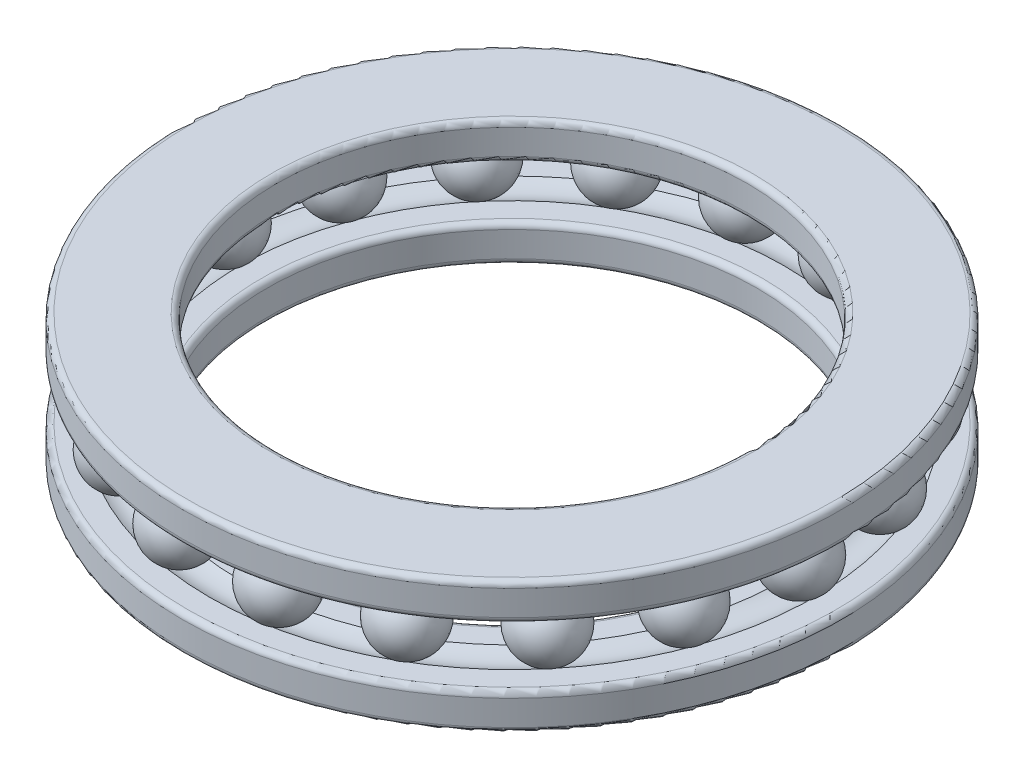
ISO-10303-21;
HEADER;
FILE_DESCRIPTION(('STEP AP214'),'2;1');
FILE_NAME('part.step','',(''),(''),'','','');
FILE_SCHEMA(('AUTOMOTIVE_DESIGN { 1 0 10303 214 1 1 1 1 }'));
ENDSEC;
DATA;
#1=APPLICATION_CONTEXT('core data for automotive mechanical design processes');
#2=APPLICATION_PROTOCOL_DEFINITION('international standard','automotive_design',2000,#1);
#3=PRODUCT_CONTEXT('',#1,'mechanical');
#4=PRODUCT('Part','Part','',(#3));
#5=PRODUCT_RELATED_PRODUCT_CATEGORY('part','',(#4));
#6=PRODUCT_DEFINITION_FORMATION('','',#4);
#7=PRODUCT_DEFINITION_CONTEXT('part definition',#1,'design');
#8=PRODUCT_DEFINITION('design','',#6,#7);
#9=PRODUCT_DEFINITION_SHAPE('','',#8);
#10=(LENGTH_UNIT() NAMED_UNIT(*) SI_UNIT(.MILLI.,.METRE.));
#11=(NAMED_UNIT(*) PLANE_ANGLE_UNIT() SI_UNIT($,.RADIAN.));
#12=(NAMED_UNIT(*) SI_UNIT($,.STERADIAN.) SOLID_ANGLE_UNIT());
#13=UNCERTAINTY_MEASURE_WITH_UNIT(LENGTH_MEASURE(1.E-05),#10,'distance_accuracy_value','');
#14=(GEOMETRIC_REPRESENTATION_CONTEXT(3) GLOBAL_UNCERTAINTY_ASSIGNED_CONTEXT((#13)) GLOBAL_UNIT_ASSIGNED_CONTEXT((#10,
#11,#12)) REPRESENTATION_CONTEXT('',''));
#15=CARTESIAN_POINT('',(0.,0.,0.));
#16=DIRECTION('',(0.,0.,1.));
#17=DIRECTION('',(1.,0.,0.));
#18=AXIS2_PLACEMENT_3D('',#15,#16,#17);
#19=CARTESIAN_POINT('',(-30.5,7.,0.));
#20=DIRECTION('',(0.,-1.,0.));
#21=DIRECTION('',(1.,0.,0.));
#22=AXIS2_PLACEMENT_3D('',#19,#20,#21);
#23=SPHERICAL_SURFACE('',#22,3.5);
#24=CARTESIAN_POINT('',(-30.5,10.5,0.));
#25=VERTEX_POINT('',#24);
#26=VERTEX_LOOP('',#25);
#27=FACE_BOUND('',#26,.T.);
#28=CARTESIAN_POINT('',(-30.5,3.5,0.));
#29=VERTEX_POINT('',#28);
#30=VERTEX_LOOP('',#29);
#31=FACE_BOUND('',#30,.T.);
#32=ADVANCED_FACE('P0_F15',(#27,#31),#23,.T.);
#33=CLOSED_SHELL('',(#32));
#34=MANIFOLD_SOLID_BREP('P0_B1',#33);
#35=CARTESIAN_POINT('',(30.5,7.,0.));
#36=DIRECTION('',(0.,-1.,0.));
#37=DIRECTION('',(1.,0.,0.));
#38=AXIS2_PLACEMENT_3D('',#35,#36,#37);
#39=SPHERICAL_SURFACE('',#38,3.5);
#40=CARTESIAN_POINT('',(30.5,10.5,0.));
#41=VERTEX_POINT('',#40);
#42=VERTEX_LOOP('',#41);
#43=FACE_BOUND('',#42,.T.);
#44=CARTESIAN_POINT('',(30.5,3.5,0.));
#45=VERTEX_POINT('',#44);
#46=VERTEX_LOOP('',#45);
#47=FACE_BOUND('',#46,.T.);
#48=ADVANCED_FACE('P1_F15',(#43,#47),#39,.T.);
#49=CLOSED_SHELL('',(#48));
#50=MANIFOLD_SOLID_BREP('P1_B1',#49);
#51=CARTESIAN_POINT('',(28.66062493397,7.,-10.431614371433));
#52=DIRECTION('',(0.,-1.,0.));
#53=DIRECTION('',(1.,0.,0.));
#54=AXIS2_PLACEMENT_3D('',#51,#52,#53);
#55=SPHERICAL_SURFACE('',#54,3.5);
#56=CARTESIAN_POINT('',(28.66062493397,10.5,-10.431614371433));
#57=VERTEX_POINT('',#56);
#58=VERTEX_LOOP('',#57);
#59=FACE_BOUND('',#58,.T.);
#60=CARTESIAN_POINT('',(28.66062493397,3.5,-10.431614371433));
#61=VERTEX_POINT('',#60);
#62=VERTEX_LOOP('',#61);
#63=FACE_BOUND('',#62,.T.);
#64=ADVANCED_FACE('P2_F15',(#59,#63),#55,.T.);
#65=CLOSED_SHELL('',(#64));
#66=MANIFOLD_SOLID_BREP('P2_B1',#65);
#67=CARTESIAN_POINT('',(23.364355515129,7.,-19.605022095439));
#68=DIRECTION('',(0.,-1.,0.));
#69=DIRECTION('',(1.,0.,0.));
#70=AXIS2_PLACEMENT_3D('',#67,#68,#69);
#71=SPHERICAL_SURFACE('',#70,3.5);
#72=CARTESIAN_POINT('',(23.364355515129,10.5,-19.605022095439));
#73=VERTEX_POINT('',#72);
#74=VERTEX_LOOP('',#73);
#75=FACE_BOUND('',#74,.T.);
#76=CARTESIAN_POINT('',(23.364355515129,3.5,-19.605022095439));
#77=VERTEX_POINT('',#76);
#78=VERTEX_LOOP('',#77);
#79=FACE_BOUND('',#78,.T.);
#80=ADVANCED_FACE('P3_F15',(#75,#79),#71,.T.);
#81=CLOSED_SHELL('',(#80));
#82=MANIFOLD_SOLID_BREP('P3_B1',#81);
#83=CARTESIAN_POINT('',(15.25,7.,-26.413774815425));
#84=DIRECTION('',(0.,-1.,0.));
#85=DIRECTION('',(1.,0.,0.));
#86=AXIS2_PLACEMENT_3D('',#83,#84,#85);
#87=SPHERICAL_SURFACE('',#86,3.5);
#88=CARTESIAN_POINT('',(15.25,10.5,-26.413774815425));
#89=VERTEX_POINT('',#88);
#90=VERTEX_LOOP('',#89);
#91=FACE_BOUND('',#90,.T.);
#92=CARTESIAN_POINT('',(15.25,3.5,-26.413774815425));
#93=VERTEX_POINT('',#92);
#94=VERTEX_LOOP('',#93);
#95=FACE_BOUND('',#94,.T.);
#96=ADVANCED_FACE('P4_F15',(#91,#95),#87,.T.);
#97=CLOSED_SHELL('',(#96));
#98=MANIFOLD_SOLID_BREP('P4_B1',#97);
#99=CARTESIAN_POINT('',(5.2962694188414,7.,-30.036636466872));
#100=DIRECTION('',(0.,-1.,0.));
#101=DIRECTION('',(1.,0.,0.));
#102=AXIS2_PLACEMENT_3D('',#99,#100,#101);
#103=SPHERICAL_SURFACE('',#102,3.5);
#104=CARTESIAN_POINT('',(5.2962694188414,10.5,-30.036636466872));
#105=VERTEX_POINT('',#104);
#106=VERTEX_LOOP('',#105);
#107=FACE_BOUND('',#106,.T.);
#108=CARTESIAN_POINT('',(5.2962694188414,3.5,-30.036636466872));
#109=VERTEX_POINT('',#108);
#110=VERTEX_LOOP('',#109);
#111=FACE_BOUND('',#110,.T.);
#112=ADVANCED_FACE('P5_F15',(#107,#111),#103,.T.);
#113=CLOSED_SHELL('',(#112));
#114=MANIFOLD_SOLID_BREP('P5_B1',#113);
#115=CARTESIAN_POINT('',(-5.2962694188414,7.,-30.036636466872));
#116=DIRECTION('',(0.,-1.,0.));
#117=DIRECTION('',(1.,0.,0.));
#118=AXIS2_PLACEMENT_3D('',#115,#116,#117);
#119=SPHERICAL_SURFACE('',#118,3.5);
#120=CARTESIAN_POINT('',(-5.2962694188414,10.5,-30.036636466872));
#121=VERTEX_POINT('',#120);
#122=VERTEX_LOOP('',#121);
#123=FACE_BOUND('',#122,.T.);
#124=CARTESIAN_POINT('',(-5.2962694188414,3.5,-30.036636466872));
#125=VERTEX_POINT('',#124);
#126=VERTEX_LOOP('',#125);
#127=FACE_BOUND('',#126,.T.);
#128=ADVANCED_FACE('P6_F15',(#123,#127),#119,.T.);
#129=CLOSED_SHELL('',(#128));
#130=MANIFOLD_SOLID_BREP('P6_B1',#129);
#131=CARTESIAN_POINT('',(-15.25,7.,-26.413774815425));
#132=DIRECTION('',(0.,-1.,0.));
#133=DIRECTION('',(1.,0.,0.));
#134=AXIS2_PLACEMENT_3D('',#131,#132,#133);
#135=SPHERICAL_SURFACE('',#134,3.5);
#136=CARTESIAN_POINT('',(-15.25,10.5,-26.413774815425));
#137=VERTEX_POINT('',#136);
#138=VERTEX_LOOP('',#137);
#139=FACE_BOUND('',#138,.T.);
#140=CARTESIAN_POINT('',(-15.25,3.5,-26.413774815425));
#141=VERTEX_POINT('',#140);
#142=VERTEX_LOOP('',#141);
#143=FACE_BOUND('',#142,.T.);
#144=ADVANCED_FACE('P7_F15',(#139,#143),#135,.T.);
#145=CLOSED_SHELL('',(#144));
#146=MANIFOLD_SOLID_BREP('P7_B1',#145);
#147=CARTESIAN_POINT('',(-23.364355515129,7.,-19.605022095439));
#148=DIRECTION('',(0.,-1.,0.));
#149=DIRECTION('',(1.,0.,0.));
#150=AXIS2_PLACEMENT_3D('',#147,#148,#149);
#151=SPHERICAL_SURFACE('',#150,3.5);
#152=CARTESIAN_POINT('',(-23.364355515129,10.5,-19.605022095439));
#153=VERTEX_POINT('',#152);
#154=VERTEX_LOOP('',#153);
#155=FACE_BOUND('',#154,.T.);
#156=CARTESIAN_POINT('',(-23.364355515129,3.5,-19.605022095439));
#157=VERTEX_POINT('',#156);
#158=VERTEX_LOOP('',#157);
#159=FACE_BOUND('',#158,.T.);
#160=ADVANCED_FACE('P8_F15',(#155,#159),#151,.T.);
#161=CLOSED_SHELL('',(#160));
#162=MANIFOLD_SOLID_BREP('P8_B1',#161);
#163=CARTESIAN_POINT('',(-28.66062493397,7.,-10.431614371433));
#164=DIRECTION('',(0.,-1.,0.));
#165=DIRECTION('',(1.,0.,0.));
#166=AXIS2_PLACEMENT_3D('',#163,#164,#165);
#167=SPHERICAL_SURFACE('',#166,3.5);
#168=CARTESIAN_POINT('',(-28.66062493397,10.5,-10.431614371433));
#169=VERTEX_POINT('',#168);
#170=VERTEX_LOOP('',#169);
#171=FACE_BOUND('',#170,.T.);
#172=CARTESIAN_POINT('',(-28.66062493397,3.5,-10.431614371433));
#173=VERTEX_POINT('',#172);
#174=VERTEX_LOOP('',#173);
#175=FACE_BOUND('',#174,.T.);
#176=ADVANCED_FACE('P9_F15',(#171,#175),#167,.T.);
#177=CLOSED_SHELL('',(#176));
#178=MANIFOLD_SOLID_BREP('P9_B1',#177);
#179=CARTESIAN_POINT('',(-28.66062493397,7.,10.431614371433));
#180=DIRECTION('',(0.,-1.,0.));
#181=DIRECTION('',(1.,0.,0.));
#182=AXIS2_PLACEMENT_3D('',#179,#180,#181);
#183=SPHERICAL_SURFACE('',#182,3.5);
#184=CARTESIAN_POINT('',(-28.66062493397,10.5,10.431614371433));
#185=VERTEX_POINT('',#184);
#186=VERTEX_LOOP('',#185);
#187=FACE_BOUND('',#186,.T.);
#188=CARTESIAN_POINT('',(-28.66062493397,3.5,10.431614371433));
#189=VERTEX_POINT('',#188);
#190=VERTEX_LOOP('',#189);
#191=FACE_BOUND('',#190,.T.);
#192=ADVANCED_FACE('P10_F15',(#187,#191),#183,.T.);
#193=CLOSED_SHELL('',(#192));
#194=MANIFOLD_SOLID_BREP('P10_B1',#193);
#195=CARTESIAN_POINT('',(-23.364355515129,7.,19.605022095439));
#196=DIRECTION('',(0.,-1.,0.));
#197=DIRECTION('',(1.,0.,0.));
#198=AXIS2_PLACEMENT_3D('',#195,#196,#197);
#199=SPHERICAL_SURFACE('',#198,3.5);
#200=CARTESIAN_POINT('',(-23.364355515129,10.5,19.605022095439));
#201=VERTEX_POINT('',#200);
#202=VERTEX_LOOP('',#201);
#203=FACE_BOUND('',#202,.T.);
#204=CARTESIAN_POINT('',(-23.364355515129,3.5,19.605022095439));
#205=VERTEX_POINT('',#204);
#206=VERTEX_LOOP('',#205);
#207=FACE_BOUND('',#206,.T.);
#208=ADVANCED_FACE('P11_F15',(#203,#207),#199,.T.);
#209=CLOSED_SHELL('',(#208));
#210=MANIFOLD_SOLID_BREP('P11_B1',#209);
#211=CARTESIAN_POINT('',(-15.25,7.,26.413774815425));
#212=DIRECTION('',(0.,-1.,0.));
#213=DIRECTION('',(1.,0.,0.));
#214=AXIS2_PLACEMENT_3D('',#211,#212,#213);
#215=SPHERICAL_SURFACE('',#214,3.5);
#216=CARTESIAN_POINT('',(-15.25,10.5,26.413774815425));
#217=VERTEX_POINT('',#216);
#218=VERTEX_LOOP('',#217);
#219=FACE_BOUND('',#218,.T.);
#220=CARTESIAN_POINT('',(-15.25,3.5,26.413774815425));
#221=VERTEX_POINT('',#220);
#222=VERTEX_LOOP('',#221);
#223=FACE_BOUND('',#222,.T.);
#224=ADVANCED_FACE('P12_F15',(#219,#223),#215,.T.);
#225=CLOSED_SHELL('',(#224));
#226=MANIFOLD_SOLID_BREP('P12_B1',#225);
#227=CARTESIAN_POINT('',(-5.2962694188414,7.,30.036636466872));
#228=DIRECTION('',(0.,-1.,0.));
#229=DIRECTION('',(1.,0.,0.));
#230=AXIS2_PLACEMENT_3D('',#227,#228,#229);
#231=SPHERICAL_SURFACE('',#230,3.5);
#232=CARTESIAN_POINT('',(-5.2962694188414,10.5,30.036636466872));
#233=VERTEX_POINT('',#232);
#234=VERTEX_LOOP('',#233);
#235=FACE_BOUND('',#234,.T.);
#236=CARTESIAN_POINT('',(-5.2962694188414,3.5,30.036636466872));
#237=VERTEX_POINT('',#236);
#238=VERTEX_LOOP('',#237);
#239=FACE_BOUND('',#238,.T.);
#240=ADVANCED_FACE('P13_F15',(#235,#239),#231,.T.);
#241=CLOSED_SHELL('',(#240));
#242=MANIFOLD_SOLID_BREP('P13_B1',#241);
#243=CARTESIAN_POINT('',(5.2962694188414,7.,30.036636466872));
#244=DIRECTION('',(0.,-1.,0.));
#245=DIRECTION('',(1.,0.,0.));
#246=AXIS2_PLACEMENT_3D('',#243,#244,#245);
#247=SPHERICAL_SURFACE('',#246,3.5);
#248=CARTESIAN_POINT('',(5.2962694188414,10.5,30.036636466872));
#249=VERTEX_POINT('',#248);
#250=VERTEX_LOOP('',#249);
#251=FACE_BOUND('',#250,.T.);
#252=CARTESIAN_POINT('',(5.2962694188414,3.5,30.036636466872));
#253=VERTEX_POINT('',#252);
#254=VERTEX_LOOP('',#253);
#255=FACE_BOUND('',#254,.T.);
#256=ADVANCED_FACE('P14_F15',(#251,#255),#247,.T.);
#257=CLOSED_SHELL('',(#256));
#258=MANIFOLD_SOLID_BREP('P14_B1',#257);
#259=CARTESIAN_POINT('',(15.25,7.,26.413774815425));
#260=DIRECTION('',(0.,-1.,0.));
#261=DIRECTION('',(1.,0.,0.));
#262=AXIS2_PLACEMENT_3D('',#259,#260,#261);
#263=SPHERICAL_SURFACE('',#262,3.5);
#264=CARTESIAN_POINT('',(15.25,10.5,26.413774815425));
#265=VERTEX_POINT('',#264);
#266=VERTEX_LOOP('',#265);
#267=FACE_BOUND('',#266,.T.);
#268=CARTESIAN_POINT('',(15.25,3.5,26.413774815425));
#269=VERTEX_POINT('',#268);
#270=VERTEX_LOOP('',#269);
#271=FACE_BOUND('',#270,.T.);
#272=ADVANCED_FACE('P15_F15',(#267,#271),#263,.T.);
#273=CLOSED_SHELL('',(#272));
#274=MANIFOLD_SOLID_BREP('P15_B1',#273);
#275=CARTESIAN_POINT('',(23.364355515129,7.,19.605022095439));
#276=DIRECTION('',(0.,-1.,0.));
#277=DIRECTION('',(1.,0.,0.));
#278=AXIS2_PLACEMENT_3D('',#275,#276,#277);
#279=SPHERICAL_SURFACE('',#278,3.5);
#280=CARTESIAN_POINT('',(23.364355515129,10.5,19.605022095439));
#281=VERTEX_POINT('',#280);
#282=VERTEX_LOOP('',#281);
#283=FACE_BOUND('',#282,.T.);
#284=CARTESIAN_POINT('',(23.364355515129,3.5,19.605022095439));
#285=VERTEX_POINT('',#284);
#286=VERTEX_LOOP('',#285);
#287=FACE_BOUND('',#286,.T.);
#288=ADVANCED_FACE('P16_F15',(#283,#287),#279,.T.);
#289=CLOSED_SHELL('',(#288));
#290=MANIFOLD_SOLID_BREP('P16_B1',#289);
#291=CARTESIAN_POINT('',(28.66062493397,7.,10.431614371433));
#292=DIRECTION('',(0.,-1.,0.));
#293=DIRECTION('',(1.,0.,0.));
#294=AXIS2_PLACEMENT_3D('',#291,#292,#293);
#295=SPHERICAL_SURFACE('',#294,3.5);
#296=CARTESIAN_POINT('',(28.66062493397,10.5,10.431614371433));
#297=VERTEX_POINT('',#296);
#298=VERTEX_LOOP('',#297);
#299=FACE_BOUND('',#298,.T.);
#300=CARTESIAN_POINT('',(28.66062493397,3.5,10.431614371433));
#301=VERTEX_POINT('',#300);
#302=VERTEX_LOOP('',#301);
#303=FACE_BOUND('',#302,.T.);
#304=ADVANCED_FACE('P17_F15',(#299,#303),#295,.T.);
#305=CLOSED_SHELL('',(#304));
#306=MANIFOLD_SOLID_BREP('P17_B1',#305);
#307=CARTESIAN_POINT('',(-34.4,0.,0.));
#308=DIRECTION('',(0.,-1.,0.));
#309=DIRECTION('',(0.,0.,-1.));
#310=AXIS2_PLACEMENT_3D('',#307,#308,#309);
#311=PLANE('',#310);
#312=CARTESIAN_POINT('',(0.,0.,0.));
#313=DIRECTION('',(0.,1.,0.));
#314=DIRECTION('',(0.,0.,1.));
#315=AXIS2_PLACEMENT_3D('',#312,#313,#314);
#316=CIRCLE('',#315,26.6);
#317=CARTESIAN_POINT('',(0.,0.,26.6));
#318=VERTEX_POINT('',#317);
#319=EDGE_CURVE('P18_E58',#318,#318,#316,.T.);
#320=ORIENTED_EDGE('',*,*,#319,.T.);
#321=EDGE_LOOP('',(#320));
#322=FACE_BOUND('',#321,.T.);
#323=CARTESIAN_POINT('',(0.,0.,0.));
#324=DIRECTION('',(0.,1.,0.));
#325=DIRECTION('',(0.,0.,1.));
#326=AXIS2_PLACEMENT_3D('',#323,#324,#325);
#327=CIRCLE('',#326,34.4);
#328=CARTESIAN_POINT('',(0.,0.,34.4));
#329=VERTEX_POINT('',#328);
#330=EDGE_CURVE('P18_E57',#329,#329,#327,.T.);
#331=ORIENTED_EDGE('',*,*,#330,.F.);
#332=EDGE_LOOP('',(#331));
#333=FACE_BOUND('',#332,.T.);
#334=ADVANCED_FACE('P18_F15',(#322,#333),#311,.T.);
#335=CARTESIAN_POINT('',(0.,0.599999999999872,0.));
#336=DIRECTION('',(0.,1.,0.));
#337=DIRECTION('',(0.,0.,1.));
#338=AXIS2_PLACEMENT_3D('',#335,#336,#337);
#339=TOROIDAL_SURFACE('',#338,26.6,0.599999999999872);
#340=CARTESIAN_POINT('',(0.,0.6,0.));
#341=DIRECTION('',(0.,1.,0.));
#342=DIRECTION('',(0.,0.,1.));
#343=AXIS2_PLACEMENT_3D('',#340,#341,#342);
#344=CIRCLE('',#343,26.);
#345=CARTESIAN_POINT('',(0.,0.6,26.));
#346=VERTEX_POINT('',#345);
#347=EDGE_CURVE('P18_E55',#346,#346,#344,.T.);
#348=ORIENTED_EDGE('',*,*,#347,.T.);
#349=EDGE_LOOP('',(#348));
#350=FACE_BOUND('',#349,.T.);
#351=ORIENTED_EDGE('',*,*,#319,.F.);
#352=EDGE_LOOP('',(#351));
#353=FACE_BOUND('',#352,.T.);
#354=ADVANCED_FACE('P18_F69',(#350,#353),#339,.T.);
#355=CARTESIAN_POINT('',(0.,3.8888888888889,0.));
#356=DIRECTION('',(0.,1.,0.));
#357=DIRECTION('',(0.,0.,1.));
#358=AXIS2_PLACEMENT_3D('',#355,#356,#357);
#359=CYLINDRICAL_SURFACE('',#358,26.);
#360=CARTESIAN_POINT('',(0.,3.2888888888889,0.));
#361=DIRECTION('',(0.,1.,0.));
#362=DIRECTION('',(0.,0.,1.));
#363=AXIS2_PLACEMENT_3D('',#360,#361,#362);
#364=CIRCLE('',#363,26.);
#365=CARTESIAN_POINT('',(0.,3.2888888888889,26.));
#366=VERTEX_POINT('',#365);
#367=EDGE_CURVE('P18_E48',#366,#366,#364,.T.);
#368=ORIENTED_EDGE('',*,*,#367,.T.);
#369=EDGE_LOOP('',(#368));
#370=FACE_BOUND('',#369,.T.);
#371=ORIENTED_EDGE('',*,*,#347,.F.);
#372=EDGE_LOOP('',(#371));
#373=FACE_BOUND('',#372,.T.);
#374=ADVANCED_FACE('P18_F70',(#370,#373),#359,.F.);
#375=CARTESIAN_POINT('',(0.,3.28888888888898,0.));
#376=DIRECTION('',(0.,1.,0.));
#377=DIRECTION('',(0.,0.,1.));
#378=AXIS2_PLACEMENT_3D('',#375,#376,#377);
#379=TOROIDAL_SURFACE('',#378,26.6,0.59999999999992);
#380=CARTESIAN_POINT('',(0.,3.8888888888889,0.));
#381=DIRECTION('',(0.,1.,0.));
#382=DIRECTION('',(0.,0.,1.));
#383=AXIS2_PLACEMENT_3D('',#380,#381,#382);
#384=CIRCLE('',#383,26.599999980008);
#385=CARTESIAN_POINT('',(0.,3.8888888888889,26.599999980008));
#386=VERTEX_POINT('',#385);
#387=EDGE_CURVE('P18_E44',#386,#386,#384,.T.);
#388=ORIENTED_EDGE('',*,*,#387,.T.);
#389=EDGE_LOOP('',(#388));
#390=FACE_BOUND('',#389,.T.);
#391=ORIENTED_EDGE('',*,*,#367,.F.);
#392=EDGE_LOOP('',(#391));
#393=FACE_BOUND('',#392,.T.);
#394=ADVANCED_FACE('P18_F76',(#390,#393),#379,.T.);
#395=CARTESIAN_POINT('',(-26.6,3.8888888888889,0.));
#396=DIRECTION('',(0.,1.,0.));
#397=DIRECTION('',(0.,0.,1.));
#398=AXIS2_PLACEMENT_3D('',#395,#396,#397);
#399=PLANE('',#398);
#400=CARTESIAN_POINT('',(0.,3.8888888888889,0.));
#401=DIRECTION('',(0.,1.,0.));
#402=DIRECTION('',(0.,0.,1.));
#403=AXIS2_PLACEMENT_3D('',#400,#401,#402);
#404=CIRCLE('',#403,28.896570034482);
#405=CARTESIAN_POINT('',(0.,3.8888888888889,28.896570034482));
#406=VERTEX_POINT('',#405);
#407=EDGE_CURVE('P18_E45',#406,#406,#404,.T.);
#408=ORIENTED_EDGE('',*,*,#407,.T.);
#409=EDGE_LOOP('',(#408));
#410=FACE_BOUND('',#409,.T.);
#411=ORIENTED_EDGE('',*,*,#387,.F.);
#412=EDGE_LOOP('',(#411));
#413=FACE_BOUND('',#412,.T.);
#414=ADVANCED_FACE('P18_F84',(#410,#413),#399,.T.);
#415=CARTESIAN_POINT('',(0.,7.,0.));
#416=DIRECTION('',(0.,1.,0.));
#417=DIRECTION('',(0.,0.,1.));
#418=AXIS2_PLACEMENT_3D('',#415,#416,#417);
#419=TOROIDAL_SURFACE('',#418,30.5,3.5);
#420=ORIENTED_EDGE('',*,*,#407,.F.);
#421=EDGE_LOOP('',(#420));
#422=FACE_BOUND('',#421,.T.);
#423=CARTESIAN_POINT('',(0.,3.8888888888889,0.));
#424=DIRECTION('',(0.,1.,0.));
#425=DIRECTION('',(0.,0.,1.));
#426=AXIS2_PLACEMENT_3D('',#423,#424,#425);
#427=CIRCLE('',#426,32.103429965518);
#428=CARTESIAN_POINT('',(0.,3.8888888888889,32.103429965518));
#429=VERTEX_POINT('',#428);
#430=EDGE_CURVE('P18_E40',#429,#429,#427,.T.);
#431=ORIENTED_EDGE('',*,*,#430,.T.);
#432=EDGE_LOOP('',(#431));
#433=FACE_BOUND('',#432,.T.);
#434=ADVANCED_FACE('P18_F87',(#422,#433),#419,.F.);
#435=CARTESIAN_POINT('',(-32.103429965518,3.8888888888889,0.));
#436=DIRECTION('',(0.,1.,0.));
#437=DIRECTION('',(0.,0.,1.));
#438=AXIS2_PLACEMENT_3D('',#435,#436,#437);
#439=PLANE('',#438);
#440=CARTESIAN_POINT('',(0.,3.8888888888889,0.));
#441=DIRECTION('',(0.,1.,0.));
#442=DIRECTION('',(0.,0.,1.));
#443=AXIS2_PLACEMENT_3D('',#440,#441,#442);
#444=CIRCLE('',#443,34.4);
#445=CARTESIAN_POINT('',(0.,3.8888888888889,34.4));
#446=VERTEX_POINT('',#445);
#447=EDGE_CURVE('P18_E33',#446,#446,#444,.T.);
#448=ORIENTED_EDGE('',*,*,#447,.T.);
#449=EDGE_LOOP('',(#448));
#450=FACE_BOUND('',#449,.T.);
#451=ORIENTED_EDGE('',*,*,#430,.F.);
#452=EDGE_LOOP('',(#451));
#453=FACE_BOUND('',#452,.T.);
#454=ADVANCED_FACE('P18_F93',(#450,#453),#439,.T.);
#455=CARTESIAN_POINT('',(0.,3.28888888888895,0.));
#456=DIRECTION('',(0.,1.,0.));
#457=DIRECTION('',(0.,0.,1.));
#458=AXIS2_PLACEMENT_3D('',#455,#456,#457);
#459=TOROIDAL_SURFACE('',#458,34.4,0.599999999999945);
#460=CARTESIAN_POINT('',(0.,3.2888888888889,0.));
#461=DIRECTION('',(0.,1.,0.));
#462=DIRECTION('',(0.,0.,1.));
#463=AXIS2_PLACEMENT_3D('',#460,#461,#462);
#464=CIRCLE('',#463,35.);
#465=CARTESIAN_POINT('',(0.,3.2888888888889,35.));
#466=VERTEX_POINT('',#465);
#467=EDGE_CURVE('P18_E23',#466,#466,#464,.T.);
#468=ORIENTED_EDGE('',*,*,#467,.T.);
#469=EDGE_LOOP('',(#468));
#470=FACE_BOUND('',#469,.T.);
#471=ORIENTED_EDGE('',*,*,#447,.F.);
#472=EDGE_LOOP('',(#471));
#473=FACE_BOUND('',#472,.T.);
#474=ADVANCED_FACE('P18_F92',(#470,#473),#459,.T.);
#475=CARTESIAN_POINT('',(0.,3.8888888888889,0.));
#476=DIRECTION('',(0.,1.,0.));
#477=DIRECTION('',(0.,0.,1.));
#478=AXIS2_PLACEMENT_3D('',#475,#476,#477);
#479=CYLINDRICAL_SURFACE('',#478,35.);
#480=CARTESIAN_POINT('',(0.,0.6,0.));
#481=DIRECTION('',(0.,1.,0.));
#482=DIRECTION('',(0.,0.,1.));
#483=AXIS2_PLACEMENT_3D('',#480,#481,#482);
#484=CIRCLE('',#483,35.);
#485=CARTESIAN_POINT('',(0.,0.6,35.));
#486=VERTEX_POINT('',#485);
#487=EDGE_CURVE('P18_E10',#486,#486,#484,.T.);
#488=ORIENTED_EDGE('',*,*,#487,.T.);
#489=EDGE_LOOP('',(#488));
#490=FACE_BOUND('',#489,.T.);
#491=ORIENTED_EDGE('',*,*,#467,.F.);
#492=EDGE_LOOP('',(#491));
#493=FACE_BOUND('',#492,.T.);
#494=ADVANCED_FACE('P18_F98',(#490,#493),#479,.T.);
#495=CARTESIAN_POINT('',(0.,0.599999999999892,0.));
#496=DIRECTION('',(0.,1.,0.));
#497=DIRECTION('',(0.,0.,1.));
#498=AXIS2_PLACEMENT_3D('',#495,#496,#497);
#499=TOROIDAL_SURFACE('',#498,34.4,0.599999999999892);
#500=ORIENTED_EDGE('',*,*,#330,.T.);
#501=EDGE_LOOP('',(#500));
#502=FACE_BOUND('',#501,.T.);
#503=ORIENTED_EDGE('',*,*,#487,.F.);
#504=EDGE_LOOP('',(#503));
#505=FACE_BOUND('',#504,.T.);
#506=ADVANCED_FACE('P18_F17',(#502,#505),#499,.T.);
#507=CLOSED_SHELL('',(#334,#354,#374,#394,#414,#434,#454,#474,#494,#506));
#508=MANIFOLD_SOLID_BREP('P18_B1',#507);
#509=CARTESIAN_POINT('',(-34.4,10.111111111111,0.));
#510=DIRECTION('',(0.,-1.,0.));
#511=DIRECTION('',(0.,0.,1.));
#512=AXIS2_PLACEMENT_3D('',#509,#510,#511);
#513=PLANE('',#512);
#514=CARTESIAN_POINT('',(0.,10.111111111111,0.));
#515=DIRECTION('',(0.,1.,0.));
#516=DIRECTION('',(0.,0.,-1.));
#517=AXIS2_PLACEMENT_3D('',#514,#515,#516);
#518=CIRCLE('',#517,32.103429965518);
#519=CARTESIAN_POINT('',(0.,10.111111111111,-32.103429965518));
#520=VERTEX_POINT('',#519);
#521=EDGE_CURVE('P19_E61',#520,#520,#518,.T.);
#522=ORIENTED_EDGE('',*,*,#521,.T.);
#523=EDGE_LOOP('',(#522));
#524=FACE_BOUND('',#523,.T.);
#525=CARTESIAN_POINT('',(0.,10.111111111111,0.));
#526=DIRECTION('',(0.,1.,0.));
#527=DIRECTION('',(0.,0.,-1.));
#528=AXIS2_PLACEMENT_3D('',#525,#526,#527);
#529=CIRCLE('',#528,34.4);
#530=CARTESIAN_POINT('',(0.,10.111111111111,-34.4));
#531=VERTEX_POINT('',#530);
#532=EDGE_CURVE('P19_E60',#531,#531,#529,.T.);
#533=ORIENTED_EDGE('',*,*,#532,.F.);
#534=EDGE_LOOP('',(#533));
#535=FACE_BOUND('',#534,.T.);
#536=ADVANCED_FACE('P19_F15',(#524,#535),#513,.T.);
#537=CARTESIAN_POINT('',(0.,6.9999999999998,0.));
#538=DIRECTION('',(0.,1.,0.));
#539=DIRECTION('',(0.,0.,-1.));
#540=AXIS2_PLACEMENT_3D('',#537,#538,#539);
#541=TOROIDAL_SURFACE('',#540,30.5,3.50000000000009);
#542=ORIENTED_EDGE('',*,*,#521,.F.);
#543=EDGE_LOOP('',(#542));
#544=FACE_BOUND('',#543,.T.);
#545=CARTESIAN_POINT('',(0.,10.111111111111,0.));
#546=DIRECTION('',(0.,1.,0.));
#547=DIRECTION('',(0.,0.,-1.));
#548=AXIS2_PLACEMENT_3D('',#545,#546,#547);
#549=CIRCLE('',#548,28.896570034482);
#550=CARTESIAN_POINT('',(0.,10.111111111111,-28.896570034482));
#551=VERTEX_POINT('',#550);
#552=EDGE_CURVE('P19_E52',#551,#551,#549,.T.);
#553=ORIENTED_EDGE('',*,*,#552,.T.);
#554=EDGE_LOOP('',(#553));
#555=FACE_BOUND('',#554,.T.);
#556=ADVANCED_FACE('P19_F69',(#544,#555),#541,.F.);
#557=CARTESIAN_POINT('',(-28.896570034482,10.111111111111,0.));
#558=DIRECTION('',(0.,-1.,0.));
#559=DIRECTION('',(0.,0.,1.));
#560=AXIS2_PLACEMENT_3D('',#557,#558,#559);
#561=PLANE('',#560);
#562=CARTESIAN_POINT('',(0.,10.111111111111,0.));
#563=DIRECTION('',(0.,1.,0.));
#564=DIRECTION('',(0.,0.,-1.));
#565=AXIS2_PLACEMENT_3D('',#562,#563,#564);
#566=CIRCLE('',#565,25.6);
#567=CARTESIAN_POINT('',(0.,10.111111111111,-25.6));
#568=VERTEX_POINT('',#567);
#569=EDGE_CURVE('P19_E49',#568,#568,#566,.T.);
#570=ORIENTED_EDGE('',*,*,#569,.T.);
#571=EDGE_LOOP('',(#570));
#572=FACE_BOUND('',#571,.T.);
#573=ORIENTED_EDGE('',*,*,#552,.F.);
#574=EDGE_LOOP('',(#573));
#575=FACE_BOUND('',#574,.T.);
#576=ADVANCED_FACE('P19_F66',(#572,#575),#561,.T.);
#577=CARTESIAN_POINT('',(0.,10.7111111111109,0.));
#578=DIRECTION('',(0.,1.,0.));
#579=DIRECTION('',(0.,0.,-1.));
#580=AXIS2_PLACEMENT_3D('',#577,#578,#579);
#581=TOROIDAL_SURFACE('',#580,25.6,0.599999999999872);
#582=CARTESIAN_POINT('',(0.,10.711111111111,0.));
#583=DIRECTION('',(0.,1.,0.));
#584=DIRECTION('',(0.,0.,-1.));
#585=AXIS2_PLACEMENT_3D('',#582,#583,#584);
#586=CIRCLE('',#585,25.);
#587=CARTESIAN_POINT('',(0.,10.711111111111,-25.));
#588=VERTEX_POINT('',#587);
#589=EDGE_CURVE('P19_E50',#588,#588,#586,.T.);
#590=ORIENTED_EDGE('',*,*,#589,.T.);
#591=EDGE_LOOP('',(#590));
#592=FACE_BOUND('',#591,.T.);
#593=ORIENTED_EDGE('',*,*,#569,.F.);
#594=EDGE_LOOP('',(#593));
#595=FACE_BOUND('',#594,.T.);
#596=ADVANCED_FACE('P19_F74',(#592,#595),#581,.T.);
#597=CARTESIAN_POINT('',(0.,13.9999999999999,0.));
#598=DIRECTION('',(0.,1.,0.));
#599=DIRECTION('',(0.,0.,-1.));
#600=AXIS2_PLACEMENT_3D('',#597,#598,#599);
#601=CYLINDRICAL_SURFACE('',#600,25.);
#602=CARTESIAN_POINT('',(0.,13.3999999999999,0.));
#603=DIRECTION('',(0.,1.,0.));
#604=DIRECTION('',(0.,0.,-1.));
#605=AXIS2_PLACEMENT_3D('',#602,#603,#604);
#606=CIRCLE('',#605,25.);
#607=CARTESIAN_POINT('',(0.,13.3999999999999,-25.));
#608=VERTEX_POINT('',#607);
#609=EDGE_CURVE('P19_E43',#608,#608,#606,.T.);
#610=ORIENTED_EDGE('',*,*,#609,.T.);
#611=EDGE_LOOP('',(#610));
#612=FACE_BOUND('',#611,.T.);
#613=ORIENTED_EDGE('',*,*,#589,.F.);
#614=EDGE_LOOP('',(#613));
#615=FACE_BOUND('',#614,.T.);
#616=ADVANCED_FACE('P19_F82',(#612,#615),#601,.F.);
#617=CARTESIAN_POINT('',(0.,13.4,0.));
#618=DIRECTION('',(0.,1.,0.));
#619=DIRECTION('',(0.,0.,-1.));
#620=AXIS2_PLACEMENT_3D('',#617,#618,#619);
#621=TOROIDAL_SURFACE('',#620,25.6,0.59999999999992);
#622=CARTESIAN_POINT('',(0.,13.9999999999999,0.));
#623=DIRECTION('',(0.,1.,0.));
#624=DIRECTION('',(0.,0.,-1.));
#625=AXIS2_PLACEMENT_3D('',#622,#623,#624);
#626=CIRCLE('',#625,25.599999980008);
#627=CARTESIAN_POINT('',(0.,13.9999999999999,-25.599999980008));
#628=VERTEX_POINT('',#627);
#629=EDGE_CURVE('P19_E40',#628,#628,#626,.T.);
#630=ORIENTED_EDGE('',*,*,#629,.T.);
#631=EDGE_LOOP('',(#630));
#632=FACE_BOUND('',#631,.T.);
#633=ORIENTED_EDGE('',*,*,#609,.F.);
#634=EDGE_LOOP('',(#633));
#635=FACE_BOUND('',#634,.T.);
#636=ADVANCED_FACE('P19_F117',(#632,#635),#621,.T.);
#637=CARTESIAN_POINT('',(-25.6,13.9999999999999,0.));
#638=DIRECTION('',(0.,1.,0.));
#639=DIRECTION('',(0.,0.,-1.));
#640=AXIS2_PLACEMENT_3D('',#637,#638,#639);
#641=PLANE('',#640);
#642=CARTESIAN_POINT('',(0.,13.9999999999999,0.));
#643=DIRECTION('',(0.,1.,0.));
#644=DIRECTION('',(0.,0.,-1.));
#645=AXIS2_PLACEMENT_3D('',#642,#643,#644);
#646=CIRCLE('',#645,34.4);
#647=CARTESIAN_POINT('',(0.,13.9999999999999,-34.4));
#648=VERTEX_POINT('',#647);
#649=EDGE_CURVE('P19_E33',#648,#648,#646,.T.);
#650=ORIENTED_EDGE('',*,*,#649,.T.);
#651=EDGE_LOOP('',(#650));
#652=FACE_BOUND('',#651,.T.);
#653=ORIENTED_EDGE('',*,*,#629,.F.);
#654=EDGE_LOOP('',(#653));
#655=FACE_BOUND('',#654,.T.);
#656=ADVANCED_FACE('P19_F126',(#652,#655),#641,.T.);
#657=CARTESIAN_POINT('',(0.,13.4,0.));
#658=DIRECTION('',(0.,1.,0.));
#659=DIRECTION('',(0.,0.,-1.));
#660=AXIS2_PLACEMENT_3D('',#657,#658,#659);
#661=TOROIDAL_SURFACE('',#660,34.4,0.599999999999945);
#662=CARTESIAN_POINT('',(0.,13.3999999999999,0.));
#663=DIRECTION('',(0.,1.,0.));
#664=DIRECTION('',(0.,0.,-1.));
#665=AXIS2_PLACEMENT_3D('',#662,#663,#664);
#666=CIRCLE('',#665,35.);
#667=CARTESIAN_POINT('',(0.,13.3999999999999,-35.));
#668=VERTEX_POINT('',#667);
#669=EDGE_CURVE('P19_E23',#668,#668,#666,.T.);
#670=ORIENTED_EDGE('',*,*,#669,.T.);
#671=EDGE_LOOP('',(#670));
#672=FACE_BOUND('',#671,.T.);
#673=ORIENTED_EDGE('',*,*,#649,.F.);
#674=EDGE_LOOP('',(#673));
#675=FACE_BOUND('',#674,.T.);
#676=ADVANCED_FACE('P19_F140',(#672,#675),#661,.T.);
#677=CARTESIAN_POINT('',(0.,13.9999999999999,0.));
#678=DIRECTION('',(0.,1.,0.));
#679=DIRECTION('',(0.,0.,-1.));
#680=AXIS2_PLACEMENT_3D('',#677,#678,#679);
#681=CYLINDRICAL_SURFACE('',#680,35.);
#682=CARTESIAN_POINT('',(0.,10.711111111111,0.));
#683=DIRECTION('',(0.,1.,0.));
#684=DIRECTION('',(0.,0.,-1.));
#685=AXIS2_PLACEMENT_3D('',#682,#683,#684);
#686=CIRCLE('',#685,35.);
#687=CARTESIAN_POINT('',(0.,10.711111111111,-35.));
#688=VERTEX_POINT('',#687);
#689=EDGE_CURVE('P19_E10',#688,#688,#686,.T.);
#690=ORIENTED_EDGE('',*,*,#689,.T.);
#691=EDGE_LOOP('',(#690));
#692=FACE_BOUND('',#691,.T.);
#693=ORIENTED_EDGE('',*,*,#669,.F.);
#694=EDGE_LOOP('',(#693));
#695=FACE_BOUND('',#694,.T.);
#696=ADVANCED_FACE('P19_F150',(#692,#695),#681,.T.);
#697=CARTESIAN_POINT('',(0.,10.7111111111109,0.));
#698=DIRECTION('',(0.,1.,0.));
#699=DIRECTION('',(0.,0.,-1.));
#700=AXIS2_PLACEMENT_3D('',#697,#698,#699);
#701=TOROIDAL_SURFACE('',#700,34.4,0.599999999999892);
#702=ORIENTED_EDGE('',*,*,#532,.T.);
#703=EDGE_LOOP('',(#702));
#704=FACE_BOUND('',#703,.T.);
#705=ORIENTED_EDGE('',*,*,#689,.F.);
#706=EDGE_LOOP('',(#705));
#707=FACE_BOUND('',#706,.T.);
#708=ADVANCED_FACE('P19_F17',(#704,#707),#701,.T.);
#709=CLOSED_SHELL('',(#536,#556,#576,#596,#616,#636,#656,#676,#696,#708));
#710=MANIFOLD_SOLID_BREP('P19_B1',#709);
#711=ADVANCED_BREP_SHAPE_REPRESENTATION('',(#18,#34,#50,#66,#82,#98,#114,#130,#146,#162,#178,
#194,#210,#226,#242,#258,#274,#290,#306,#508,#710),#14);
#712=SHAPE_DEFINITION_REPRESENTATION(#9,#711);
ENDSEC;
END-ISO-10303-21;
